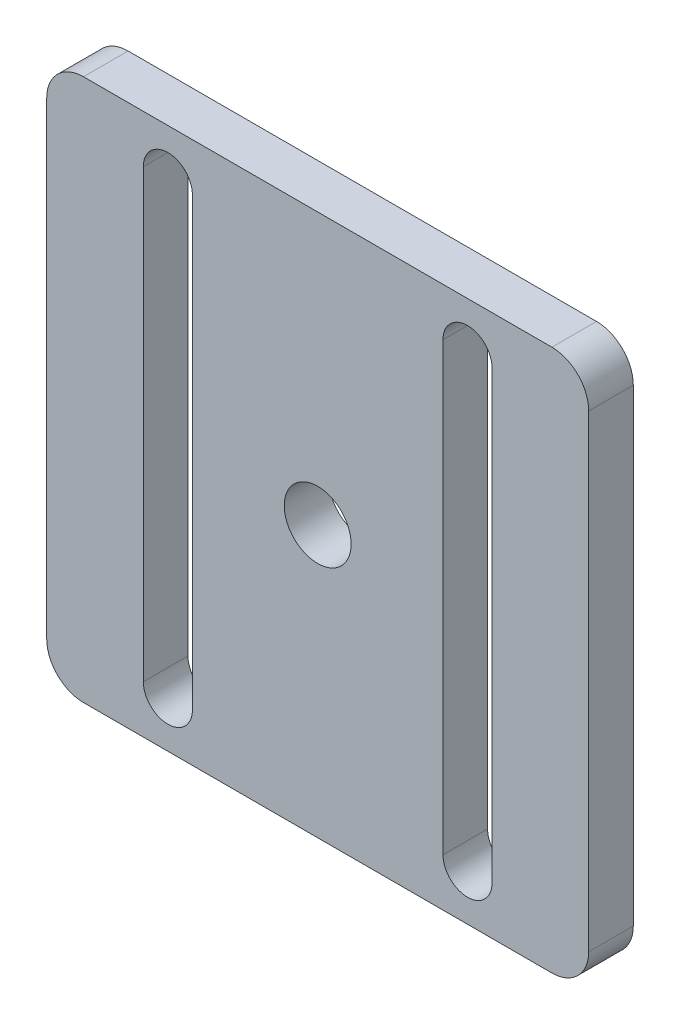
ISO-10303-21;
HEADER;
FILE_DESCRIPTION(('STEP AP214'),'2;1');
FILE_NAME('part.step','',(''),(''),'','','');
FILE_SCHEMA(('AUTOMOTIVE_DESIGN { 1 0 10303 214 1 1 1 1 }'));
ENDSEC;
DATA;
#1=APPLICATION_CONTEXT('core data for automotive mechanical design processes');
#2=APPLICATION_PROTOCOL_DEFINITION('international standard','automotive_design',2000,#1);
#3=PRODUCT_CONTEXT('',#1,'mechanical');
#4=PRODUCT('Part','Part','',(#3));
#5=PRODUCT_RELATED_PRODUCT_CATEGORY('part','',(#4));
#6=PRODUCT_DEFINITION_FORMATION('','',#4);
#7=PRODUCT_DEFINITION_CONTEXT('part definition',#1,'design');
#8=PRODUCT_DEFINITION('design','',#6,#7);
#9=PRODUCT_DEFINITION_SHAPE('','',#8);
#10=(LENGTH_UNIT() NAMED_UNIT(*) SI_UNIT(.MILLI.,.METRE.));
#11=(NAMED_UNIT(*) PLANE_ANGLE_UNIT() SI_UNIT($,.RADIAN.));
#12=(NAMED_UNIT(*) SI_UNIT($,.STERADIAN.) SOLID_ANGLE_UNIT());
#13=UNCERTAINTY_MEASURE_WITH_UNIT(LENGTH_MEASURE(1.E-05),#10,'distance_accuracy_value','');
#14=(GEOMETRIC_REPRESENTATION_CONTEXT(3) GLOBAL_UNCERTAINTY_ASSIGNED_CONTEXT((#13)) GLOBAL_UNIT_ASSIGNED_CONTEXT((#10,
#11,#12)) REPRESENTATION_CONTEXT('',''));
#15=CARTESIAN_POINT('',(0.,0.,0.));
#16=DIRECTION('',(0.,0.,1.));
#17=DIRECTION('',(1.,0.,0.));
#18=AXIS2_PLACEMENT_3D('',#15,#16,#17);
#19=CARTESIAN_POINT('',(-96.327111855095,68.8501976777567,2.));
#20=DIRECTION('',(0.,0.,1.));
#21=DIRECTION('',(1.,0.,0.));
#22=AXIS2_PLACEMENT_3D('',#19,#20,#21);
#23=PLANE('',#22);
#24=CARTESIAN_POINT('',(-106.827111855095,58.3501976777567,2.));
#25=DIRECTION('',(0.,0.,1.));
#26=DIRECTION('',(1.,0.,0.));
#27=AXIS2_PLACEMENT_3D('',#24,#25,#26);
#28=CIRCLE('',#27,1.5);
#29=CARTESIAN_POINT('',(-105.327111855095,58.3501976777567,2.));
#30=VERTEX_POINT('',#29);
#31=EDGE_CURVE('E214',#30,#30,#28,.T.);
#32=ORIENTED_EDGE('',*,*,#31,.F.);
#33=EDGE_LOOP('',(#32));
#34=FACE_BOUND('',#33,.T.);
#35=DIRECTION('',(0.,-1.,0.));
#36=VECTOR('',#35,1.);
#37=CARTESIAN_POINT('',(-114.644626276367,68.3501976777567,2.));
#38=LINE('',#37,#36);
#39=CARTESIAN_POINT('',(-114.644626276367,68.3501976777567,2.));
#40=VERTEX_POINT('',#39);
#41=CARTESIAN_POINT('',(-114.644626276367,48.3501976777567,2.));
#42=VERTEX_POINT('',#41);
#43=EDGE_CURVE('E253',#40,#42,#38,.T.);
#44=ORIENTED_EDGE('',*,*,#43,.F.);
#45=CARTESIAN_POINT('',(-113.544626276367,68.3501976777567,2.));
#46=DIRECTION('',(0.,0.,1.));
#47=DIRECTION('',(1.,0.,0.));
#48=AXIS2_PLACEMENT_3D('',#45,#46,#47);
#49=CIRCLE('',#48,1.1);
#50=CARTESIAN_POINT('',(-112.444626276367,68.3501976777567,2.));
#51=VERTEX_POINT('',#50);
#52=EDGE_CURVE('E251',#51,#40,#49,.T.);
#53=ORIENTED_EDGE('',*,*,#52,.F.);
#54=DIRECTION('',(0.,1.,0.));
#55=VECTOR('',#54,1.);
#56=CARTESIAN_POINT('',(-112.444626276367,48.3501976777567,2.));
#57=LINE('',#56,#55);
#58=CARTESIAN_POINT('',(-112.444626276367,48.3501976777567,2.));
#59=VERTEX_POINT('',#58);
#60=EDGE_CURVE('E259',#59,#51,#57,.T.);
#61=ORIENTED_EDGE('',*,*,#60,.F.);
#62=CARTESIAN_POINT('',(-113.544626276367,48.3501976777567,2.));
#63=DIRECTION('',(0.,0.,1.));
#64=DIRECTION('',(1.,0.,0.));
#65=AXIS2_PLACEMENT_3D('',#62,#63,#64);
#66=CIRCLE('',#65,1.10000000000001);
#67=EDGE_CURVE('E256',#42,#59,#66,.T.);
#68=ORIENTED_EDGE('',*,*,#67,.F.);
#69=EDGE_LOOP('',(#44,#53,#61,#68));
#70=FACE_BOUND('',#69,.T.);
#71=DIRECTION('',(0.,-1.,0.));
#72=VECTOR('',#71,1.);
#73=CARTESIAN_POINT('',(-101.209597433823,68.3501976777567,2.));
#74=LINE('',#73,#72);
#75=CARTESIAN_POINT('',(-101.209597433823,68.3501976777567,2.));
#76=VERTEX_POINT('',#75);
#77=CARTESIAN_POINT('',(-101.209597433823,48.3501976777567,2.));
#78=VERTEX_POINT('',#77);
#79=EDGE_CURVE('E222',#76,#78,#74,.T.);
#80=ORIENTED_EDGE('',*,*,#79,.F.);
#81=CARTESIAN_POINT('',(-100.109597433823,68.3501976777567,2.));
#82=DIRECTION('',(0.,0.,1.));
#83=DIRECTION('',(1.,0.,0.));
#84=AXIS2_PLACEMENT_3D('',#81,#82,#83);
#85=CIRCLE('',#84,1.1);
#86=CARTESIAN_POINT('',(-99.0095974338228,68.3501976777567,2.));
#87=VERTEX_POINT('',#86);
#88=EDGE_CURVE('E220',#87,#76,#85,.T.);
#89=ORIENTED_EDGE('',*,*,#88,.F.);
#90=DIRECTION('',(0.,1.,0.));
#91=VECTOR('',#90,1.);
#92=CARTESIAN_POINT('',(-99.0095974338228,48.3501976777567,2.));
#93=LINE('',#92,#91);
#94=CARTESIAN_POINT('',(-99.0095974338228,48.3501976777567,2.));
#95=VERTEX_POINT('',#94);
#96=EDGE_CURVE('E228',#95,#87,#93,.T.);
#97=ORIENTED_EDGE('',*,*,#96,.F.);
#98=CARTESIAN_POINT('',(-100.109597433823,48.3501976777567,2.));
#99=DIRECTION('',(0.,0.,1.));
#100=DIRECTION('',(1.,0.,0.));
#101=AXIS2_PLACEMENT_3D('',#98,#99,#100);
#102=CIRCLE('',#101,1.1);
#103=EDGE_CURVE('E225',#78,#95,#102,.T.);
#104=ORIENTED_EDGE('',*,*,#103,.F.);
#105=EDGE_LOOP('',(#80,#89,#97,#104));
#106=FACE_BOUND('',#105,.T.);
#107=DIRECTION('',(0.,1.,0.));
#108=VECTOR('',#107,1.);
#109=CARTESIAN_POINT('',(-94.677111855095,47.8501976777567,2.));
#110=LINE('',#109,#108);
#111=CARTESIAN_POINT('',(-94.677111855095,47.8501976777567,2.));
#112=VERTEX_POINT('',#111);
#113=CARTESIAN_POINT('',(-94.677111855095,68.8501976777567,2.));
#114=VERTEX_POINT('',#113);
#115=EDGE_CURVE('E199',#112,#114,#110,.T.);
#116=ORIENTED_EDGE('',*,*,#115,.T.);
#117=CARTESIAN_POINT('',(-96.327111855095,68.8501976777567,2.));
#118=DIRECTION('',(0.,0.,1.));
#119=DIRECTION('',(1.,0.,0.));
#120=AXIS2_PLACEMENT_3D('',#117,#118,#119);
#121=CIRCLE('',#120,1.65);
#122=CARTESIAN_POINT('',(-96.327111855095,70.5001976777567,2.));
#123=VERTEX_POINT('',#122);
#124=EDGE_CURVE('E182',#114,#123,#121,.T.);
#125=ORIENTED_EDGE('',*,*,#124,.T.);
#126=DIRECTION('',(-1.,0.,0.));
#127=VECTOR('',#126,1.);
#128=CARTESIAN_POINT('',(-96.327111855095,70.5001976777567,2.));
#129=LINE('',#128,#127);
#130=CARTESIAN_POINT('',(-117.327111855095,70.5001976777567,2.));
#131=VERTEX_POINT('',#130);
#132=EDGE_CURVE('E185',#123,#131,#129,.T.);
#133=ORIENTED_EDGE('',*,*,#132,.T.);
#134=CARTESIAN_POINT('',(-117.327111855095,68.8501976777567,2.));
#135=DIRECTION('',(0.,0.,1.));
#136=DIRECTION('',(1.,0.,0.));
#137=AXIS2_PLACEMENT_3D('',#134,#135,#136);
#138=CIRCLE('',#137,1.65);
#139=CARTESIAN_POINT('',(-118.977111855095,68.8501976777567,2.));
#140=VERTEX_POINT('',#139);
#141=EDGE_CURVE('E48',#131,#140,#138,.T.);
#142=ORIENTED_EDGE('',*,*,#141,.T.);
#143=DIRECTION('',(0.,-1.,0.));
#144=VECTOR('',#143,1.);
#145=CARTESIAN_POINT('',(-118.977111855095,68.8501976777567,2.));
#146=LINE('',#145,#144);
#147=CARTESIAN_POINT('',(-118.977111855095,47.8501976777567,2.));
#148=VERTEX_POINT('',#147);
#149=EDGE_CURVE('E153',#140,#148,#146,.T.);
#150=ORIENTED_EDGE('',*,*,#149,.T.);
#151=CARTESIAN_POINT('',(-117.327111855095,47.8501976777567,2.));
#152=DIRECTION('',(0.,0.,1.));
#153=DIRECTION('',(1.,0.,0.));
#154=AXIS2_PLACEMENT_3D('',#151,#152,#153);
#155=CIRCLE('',#154,1.65);
#156=CARTESIAN_POINT('',(-117.327111855095,46.2001976777567,2.));
#157=VERTEX_POINT('',#156);
#158=EDGE_CURVE('E190',#148,#157,#155,.T.);
#159=ORIENTED_EDGE('',*,*,#158,.T.);
#160=DIRECTION('',(1.,0.,0.));
#161=VECTOR('',#160,1.);
#162=CARTESIAN_POINT('',(-117.327111855095,46.2001976777567,2.));
#163=LINE('',#162,#161);
#164=CARTESIAN_POINT('',(-96.327111855095,46.2001976777567,2.));
#165=VERTEX_POINT('',#164);
#166=EDGE_CURVE('E193',#157,#165,#163,.T.);
#167=ORIENTED_EDGE('',*,*,#166,.T.);
#168=CARTESIAN_POINT('',(-96.327111855095,47.8501976777567,2.));
#169=DIRECTION('',(0.,0.,1.));
#170=DIRECTION('',(1.,0.,0.));
#171=AXIS2_PLACEMENT_3D('',#168,#169,#170);
#172=CIRCLE('',#171,1.64999999999999);
#173=EDGE_CURVE('E196',#165,#112,#172,.T.);
#174=ORIENTED_EDGE('',*,*,#173,.T.);
#175=EDGE_LOOP('',(#116,#125,#133,#142,#150,#159,#167,#174));
#176=FACE_BOUND('',#175,.T.);
#177=ADVANCED_FACE('F33',(#34,#70,#106,#176),#23,.T.);
#178=CARTESIAN_POINT('',(-96.327111855095,68.8501976777567,0.));
#179=DIRECTION('',(0.,0.,1.));
#180=DIRECTION('',(1.,0.,0.));
#181=AXIS2_PLACEMENT_3D('',#178,#179,#180);
#182=PLANE('',#181);
#183=CARTESIAN_POINT('',(-106.827111855095,58.3501976777567,0.));
#184=DIRECTION('',(0.,0.,1.));
#185=DIRECTION('',(1.,0.,0.));
#186=AXIS2_PLACEMENT_3D('',#183,#184,#185);
#187=CIRCLE('',#186,1.5);
#188=CARTESIAN_POINT('',(-105.327111855095,58.3501976777567,0.));
#189=VERTEX_POINT('',#188);
#190=EDGE_CURVE('E204',#189,#189,#187,.T.);
#191=ORIENTED_EDGE('',*,*,#190,.T.);
#192=EDGE_LOOP('',(#191));
#193=FACE_BOUND('',#192,.T.);
#194=CARTESIAN_POINT('',(-100.109597433823,68.3501976777567,0.));
#195=DIRECTION('',(0.,0.,1.));
#196=DIRECTION('',(1.,0.,0.));
#197=AXIS2_PLACEMENT_3D('',#194,#195,#196);
#198=CIRCLE('',#197,1.1);
#199=CARTESIAN_POINT('',(-99.0095974338228,68.3501976777567,0.));
#200=VERTEX_POINT('',#199);
#201=CARTESIAN_POINT('',(-101.209597433823,68.3501976777567,0.));
#202=VERTEX_POINT('',#201);
#203=EDGE_CURVE('E217',#200,#202,#198,.T.);
#204=ORIENTED_EDGE('',*,*,#203,.T.);
#205=DIRECTION('',(0.,-1.,0.));
#206=VECTOR('',#205,1.);
#207=CARTESIAN_POINT('',(-101.209597433823,68.3501976777567,0.));
#208=LINE('',#207,#206);
#209=CARTESIAN_POINT('',(-101.209597433823,48.3501976777567,0.));
#210=VERTEX_POINT('',#209);
#211=EDGE_CURVE('E233',#202,#210,#208,.T.);
#212=ORIENTED_EDGE('',*,*,#211,.T.);
#213=CARTESIAN_POINT('',(-100.109597433823,48.3501976777567,0.));
#214=DIRECTION('',(0.,0.,1.));
#215=DIRECTION('',(1.,0.,0.));
#216=AXIS2_PLACEMENT_3D('',#213,#214,#215);
#217=CIRCLE('',#216,1.1);
#218=CARTESIAN_POINT('',(-99.0095974338228,48.3501976777567,0.));
#219=VERTEX_POINT('',#218);
#220=EDGE_CURVE('E236',#210,#219,#217,.T.);
#221=ORIENTED_EDGE('',*,*,#220,.T.);
#222=DIRECTION('',(0.,1.,0.));
#223=VECTOR('',#222,1.);
#224=CARTESIAN_POINT('',(-99.0095974338228,48.3501976777567,0.));
#225=LINE('',#224,#223);
#226=EDGE_CURVE('E223',#219,#200,#225,.T.);
#227=ORIENTED_EDGE('',*,*,#226,.T.);
#228=EDGE_LOOP('',(#204,#212,#221,#227));
#229=FACE_BOUND('',#228,.T.);
#230=CARTESIAN_POINT('',(-113.544626276367,68.3501976777567,0.));
#231=DIRECTION('',(0.,0.,1.));
#232=DIRECTION('',(1.,0.,0.));
#233=AXIS2_PLACEMENT_3D('',#230,#231,#232);
#234=CIRCLE('',#233,1.1);
#235=CARTESIAN_POINT('',(-112.444626276367,68.3501976777567,0.));
#236=VERTEX_POINT('',#235);
#237=CARTESIAN_POINT('',(-114.644626276367,68.3501976777567,0.));
#238=VERTEX_POINT('',#237);
#239=EDGE_CURVE('E250',#236,#238,#234,.T.);
#240=ORIENTED_EDGE('',*,*,#239,.T.);
#241=DIRECTION('',(0.,-1.,0.));
#242=VECTOR('',#241,1.);
#243=CARTESIAN_POINT('',(-114.644626276367,68.3501976777567,0.));
#244=LINE('',#243,#242);
#245=CARTESIAN_POINT('',(-114.644626276367,48.3501976777567,0.));
#246=VERTEX_POINT('',#245);
#247=EDGE_CURVE('E264',#238,#246,#244,.T.);
#248=ORIENTED_EDGE('',*,*,#247,.T.);
#249=CARTESIAN_POINT('',(-113.544626276367,48.3501976777567,0.));
#250=DIRECTION('',(0.,0.,1.));
#251=DIRECTION('',(1.,0.,0.));
#252=AXIS2_PLACEMENT_3D('',#249,#250,#251);
#253=CIRCLE('',#252,1.10000000000001);
#254=CARTESIAN_POINT('',(-112.444626276367,48.3501976777567,0.));
#255=VERTEX_POINT('',#254);
#256=EDGE_CURVE('E267',#246,#255,#253,.T.);
#257=ORIENTED_EDGE('',*,*,#256,.T.);
#258=DIRECTION('',(0.,1.,0.));
#259=VECTOR('',#258,1.);
#260=CARTESIAN_POINT('',(-112.444626276367,48.3501976777567,0.));
#261=LINE('',#260,#259);
#262=EDGE_CURVE('E254',#255,#236,#261,.T.);
#263=ORIENTED_EDGE('',*,*,#262,.T.);
#264=EDGE_LOOP('',(#240,#248,#257,#263));
#265=FACE_BOUND('',#264,.T.);
#266=CARTESIAN_POINT('',(-96.327111855095,68.8501976777567,0.));
#267=DIRECTION('',(0.,0.,1.));
#268=DIRECTION('',(1.,0.,0.));
#269=AXIS2_PLACEMENT_3D('',#266,#267,#268);
#270=CIRCLE('',#269,1.65);
#271=CARTESIAN_POINT('',(-94.677111855095,68.8501976777567,0.));
#272=VERTEX_POINT('',#271);
#273=CARTESIAN_POINT('',(-96.327111855095,70.5001976777567,0.));
#274=VERTEX_POINT('',#273);
#275=EDGE_CURVE('E56',#272,#274,#270,.T.);
#276=ORIENTED_EDGE('',*,*,#275,.F.);
#277=DIRECTION('',(0.,1.,0.));
#278=VECTOR('',#277,1.);
#279=CARTESIAN_POINT('',(-94.677111855095,47.8501976777567,0.));
#280=LINE('',#279,#278);
#281=CARTESIAN_POINT('',(-94.677111855095,47.8501976777567,0.));
#282=VERTEX_POINT('',#281);
#283=EDGE_CURVE('E178',#282,#272,#280,.T.);
#284=ORIENTED_EDGE('',*,*,#283,.F.);
#285=CARTESIAN_POINT('',(-96.327111855095,47.8501976777567,0.));
#286=DIRECTION('',(0.,0.,1.));
#287=DIRECTION('',(1.,0.,0.));
#288=AXIS2_PLACEMENT_3D('',#285,#286,#287);
#289=CIRCLE('',#288,1.64999999999999);
#290=CARTESIAN_POINT('',(-96.327111855095,46.2001976777567,0.));
#291=VERTEX_POINT('',#290);
#292=EDGE_CURVE('E175',#291,#282,#289,.T.);
#293=ORIENTED_EDGE('',*,*,#292,.F.);
#294=DIRECTION('',(1.,0.,0.));
#295=VECTOR('',#294,1.);
#296=CARTESIAN_POINT('',(-117.327111855095,46.2001976777567,0.));
#297=LINE('',#296,#295);
#298=CARTESIAN_POINT('',(-117.327111855095,46.2001976777567,0.));
#299=VERTEX_POINT('',#298);
#300=EDGE_CURVE('E169',#299,#291,#297,.T.);
#301=ORIENTED_EDGE('',*,*,#300,.F.);
#302=CARTESIAN_POINT('',(-117.327111855095,47.8501976777567,0.));
#303=DIRECTION('',(0.,0.,1.));
#304=DIRECTION('',(1.,0.,0.));
#305=AXIS2_PLACEMENT_3D('',#302,#303,#304);
#306=CIRCLE('',#305,1.65);
#307=CARTESIAN_POINT('',(-118.977111855095,47.8501976777567,0.));
#308=VERTEX_POINT('',#307);
#309=EDGE_CURVE('E167',#308,#299,#306,.T.);
#310=ORIENTED_EDGE('',*,*,#309,.F.);
#311=DIRECTION('',(0.,-1.,0.));
#312=VECTOR('',#311,1.);
#313=CARTESIAN_POINT('',(-118.977111855095,68.8501976777567,0.));
#314=LINE('',#313,#312);
#315=CARTESIAN_POINT('',(-118.977111855095,68.8501976777567,0.));
#316=VERTEX_POINT('',#315);
#317=EDGE_CURVE('E150',#316,#308,#314,.T.);
#318=ORIENTED_EDGE('',*,*,#317,.F.);
#319=CARTESIAN_POINT('',(-117.327111855095,68.8501976777567,0.));
#320=DIRECTION('',(0.,0.,1.));
#321=DIRECTION('',(1.,0.,0.));
#322=AXIS2_PLACEMENT_3D('',#319,#320,#321);
#323=CIRCLE('',#322,1.65);
#324=CARTESIAN_POINT('',(-117.327111855095,70.5001976777567,0.));
#325=VERTEX_POINT('',#324);
#326=EDGE_CURVE('E158',#325,#316,#323,.T.);
#327=ORIENTED_EDGE('',*,*,#326,.F.);
#328=DIRECTION('',(-1.,0.,0.));
#329=VECTOR('',#328,1.);
#330=CARTESIAN_POINT('',(-96.327111855095,70.5001976777567,0.));
#331=LINE('',#330,#329);
#332=EDGE_CURVE('E163',#274,#325,#331,.T.);
#333=ORIENTED_EDGE('',*,*,#332,.F.);
#334=EDGE_LOOP('',(#276,#284,#293,#301,#310,#318,#327,#333));
#335=FACE_BOUND('',#334,.T.);
#336=ADVANCED_FACE('F35',(#193,#229,#265,#335),#182,.F.);
#337=CARTESIAN_POINT('',(-113.544626276367,68.3501976777567,2.));
#338=DIRECTION('',(0.,0.,-1.));
#339=DIRECTION('',(-1.,0.,0.));
#340=AXIS2_PLACEMENT_3D('',#337,#338,#339);
#341=CYLINDRICAL_SURFACE('',#340,1.1);
#342=ORIENTED_EDGE('',*,*,#239,.F.);
#343=DIRECTION('',(0.,0.,-1.));
#344=VECTOR('',#343,1.);
#345=CARTESIAN_POINT('',(-112.444626276367,68.3501976777567,2.));
#346=LINE('',#345,#344);
#347=EDGE_CURVE('E261',#51,#236,#346,.T.);
#348=ORIENTED_EDGE('',*,*,#347,.F.);
#349=ORIENTED_EDGE('',*,*,#52,.T.);
#350=DIRECTION('',(0.,0.,-1.));
#351=VECTOR('',#350,1.);
#352=CARTESIAN_POINT('',(-114.644626276367,68.3501976777567,2.));
#353=LINE('',#352,#351);
#354=EDGE_CURVE('E11',#40,#238,#353,.T.);
#355=ORIENTED_EDGE('',*,*,#354,.T.);
#356=EDGE_LOOP('',(#342,#348,#349,#355));
#357=FACE_BOUND('',#356,.T.);
#358=ADVANCED_FACE('F288',(#357),#341,.F.);
#359=CARTESIAN_POINT('',(-114.644626276367,68.3501976777567,2.));
#360=DIRECTION('',(1.,0.,0.));
#361=DIRECTION('',(0.,1.,0.));
#362=AXIS2_PLACEMENT_3D('',#359,#360,#361);
#363=PLANE('',#362);
#364=ORIENTED_EDGE('',*,*,#247,.F.);
#365=ORIENTED_EDGE('',*,*,#354,.F.);
#366=ORIENTED_EDGE('',*,*,#43,.T.);
#367=DIRECTION('',(0.,0.,-1.));
#368=VECTOR('',#367,1.);
#369=CARTESIAN_POINT('',(-114.644626276367,48.3501976777567,2.));
#370=LINE('',#369,#368);
#371=EDGE_CURVE('E41',#42,#246,#370,.T.);
#372=ORIENTED_EDGE('',*,*,#371,.T.);
#373=EDGE_LOOP('',(#364,#365,#366,#372));
#374=FACE_BOUND('',#373,.T.);
#375=ADVANCED_FACE('F278',(#374),#363,.T.);
#376=CARTESIAN_POINT('',(-113.544626276367,48.3501976777567,2.));
#377=DIRECTION('',(0.,0.,-1.));
#378=DIRECTION('',(-1.,0.,0.));
#379=AXIS2_PLACEMENT_3D('',#376,#377,#378);
#380=CYLINDRICAL_SURFACE('',#379,1.10000000000001);
#381=ORIENTED_EDGE('',*,*,#256,.F.);
#382=ORIENTED_EDGE('',*,*,#371,.F.);
#383=ORIENTED_EDGE('',*,*,#67,.T.);
#384=DIRECTION('',(0.,0.,-1.));
#385=VECTOR('',#384,1.);
#386=CARTESIAN_POINT('',(-112.444626276367,48.3501976777567,2.));
#387=LINE('',#386,#385);
#388=EDGE_CURVE('E274',#59,#255,#387,.T.);
#389=ORIENTED_EDGE('',*,*,#388,.T.);
#390=EDGE_LOOP('',(#381,#382,#383,#389));
#391=FACE_BOUND('',#390,.T.);
#392=ADVANCED_FACE('F283',(#391),#380,.F.);
#393=CARTESIAN_POINT('',(-112.444626276367,48.3501976777567,2.));
#394=DIRECTION('',(-1.,0.,0.));
#395=DIRECTION('',(0.,0.,1.));
#396=AXIS2_PLACEMENT_3D('',#393,#394,#395);
#397=PLANE('',#396);
#398=ORIENTED_EDGE('',*,*,#262,.F.);
#399=ORIENTED_EDGE('',*,*,#388,.F.);
#400=ORIENTED_EDGE('',*,*,#60,.T.);
#401=ORIENTED_EDGE('',*,*,#347,.T.);
#402=EDGE_LOOP('',(#398,#399,#400,#401));
#403=FACE_BOUND('',#402,.T.);
#404=ADVANCED_FACE('F291',(#403),#397,.T.);
#405=CARTESIAN_POINT('',(-100.109597433823,68.3501976777567,2.));
#406=DIRECTION('',(0.,0.,-1.));
#407=DIRECTION('',(-1.,0.,0.));
#408=AXIS2_PLACEMENT_3D('',#405,#406,#407);
#409=CYLINDRICAL_SURFACE('',#408,1.1);
#410=ORIENTED_EDGE('',*,*,#203,.F.);
#411=DIRECTION('',(0.,0.,-1.));
#412=VECTOR('',#411,1.);
#413=CARTESIAN_POINT('',(-99.0095974338228,68.3501976777567,2.));
#414=LINE('',#413,#412);
#415=EDGE_CURVE('E230',#87,#200,#414,.T.);
#416=ORIENTED_EDGE('',*,*,#415,.F.);
#417=ORIENTED_EDGE('',*,*,#88,.T.);
#418=DIRECTION('',(0.,0.,-1.));
#419=VECTOR('',#418,1.);
#420=CARTESIAN_POINT('',(-101.209597433823,68.3501976777567,2.));
#421=LINE('',#420,#419);
#422=EDGE_CURVE('E247',#76,#202,#421,.T.);
#423=ORIENTED_EDGE('',*,*,#422,.T.);
#424=EDGE_LOOP('',(#410,#416,#417,#423));
#425=FACE_BOUND('',#424,.T.);
#426=ADVANCED_FACE('F355',(#425),#409,.F.);
#427=CARTESIAN_POINT('',(-101.209597433823,68.3501976777567,2.));
#428=DIRECTION('',(1.,0.,0.));
#429=DIRECTION('',(0.,1.,0.));
#430=AXIS2_PLACEMENT_3D('',#427,#428,#429);
#431=PLANE('',#430);
#432=ORIENTED_EDGE('',*,*,#211,.F.);
#433=ORIENTED_EDGE('',*,*,#422,.F.);
#434=ORIENTED_EDGE('',*,*,#79,.T.);
#435=DIRECTION('',(0.,0.,-1.));
#436=VECTOR('',#435,1.);
#437=CARTESIAN_POINT('',(-101.209597433823,48.3501976777567,2.));
#438=LINE('',#437,#436);
#439=EDGE_CURVE('E245',#78,#210,#438,.T.);
#440=ORIENTED_EDGE('',*,*,#439,.T.);
#441=EDGE_LOOP('',(#432,#433,#434,#440));
#442=FACE_BOUND('',#441,.T.);
#443=ADVANCED_FACE('F351',(#442),#431,.T.);
#444=CARTESIAN_POINT('',(-100.109597433823,48.3501976777567,2.));
#445=DIRECTION('',(0.,0.,-1.));
#446=DIRECTION('',(-1.,0.,0.));
#447=AXIS2_PLACEMENT_3D('',#444,#445,#446);
#448=CYLINDRICAL_SURFACE('',#447,1.1);
#449=ORIENTED_EDGE('',*,*,#220,.F.);
#450=ORIENTED_EDGE('',*,*,#439,.F.);
#451=ORIENTED_EDGE('',*,*,#103,.T.);
#452=DIRECTION('',(0.,0.,-1.));
#453=VECTOR('',#452,1.);
#454=CARTESIAN_POINT('',(-99.0095974338228,48.3501976777567,2.));
#455=LINE('',#454,#453);
#456=EDGE_CURVE('E243',#95,#219,#455,.T.);
#457=ORIENTED_EDGE('',*,*,#456,.T.);
#458=EDGE_LOOP('',(#449,#450,#451,#457));
#459=FACE_BOUND('',#458,.T.);
#460=ADVANCED_FACE('F347',(#459),#448,.F.);
#461=CARTESIAN_POINT('',(-99.0095974338228,48.3501976777567,2.));
#462=DIRECTION('',(-1.,0.,0.));
#463=DIRECTION('',(0.,0.,1.));
#464=AXIS2_PLACEMENT_3D('',#461,#462,#463);
#465=PLANE('',#464);
#466=ORIENTED_EDGE('',*,*,#226,.F.);
#467=ORIENTED_EDGE('',*,*,#456,.F.);
#468=ORIENTED_EDGE('',*,*,#96,.T.);
#469=ORIENTED_EDGE('',*,*,#415,.T.);
#470=EDGE_LOOP('',(#466,#467,#468,#469));
#471=FACE_BOUND('',#470,.T.);
#472=ADVANCED_FACE('F343',(#471),#465,.T.);
#473=CARTESIAN_POINT('',(-106.827111855095,58.3501976777567,2.));
#474=DIRECTION('',(0.,0.,-1.));
#475=DIRECTION('',(-1.,0.,0.));
#476=AXIS2_PLACEMENT_3D('',#473,#474,#475);
#477=CYLINDRICAL_SURFACE('',#476,1.5);
#478=ORIENTED_EDGE('',*,*,#31,.T.);
#479=EDGE_LOOP('',(#478));
#480=FACE_BOUND('',#479,.T.);
#481=ORIENTED_EDGE('',*,*,#190,.F.);
#482=EDGE_LOOP('',(#481));
#483=FACE_BOUND('',#482,.T.);
#484=ADVANCED_FACE('F340',(#480,#483),#477,.F.);
#485=CARTESIAN_POINT('',(-96.327111855095,68.8501976777567,0.));
#486=DIRECTION('',(0.,0.,1.));
#487=DIRECTION('',(1.,0.,0.));
#488=AXIS2_PLACEMENT_3D('',#485,#486,#487);
#489=CYLINDRICAL_SURFACE('',#488,1.65);
#490=ORIENTED_EDGE('',*,*,#124,.F.);
#491=DIRECTION('',(0.,0.,1.));
#492=VECTOR('',#491,1.);
#493=CARTESIAN_POINT('',(-94.677111855095,68.8501976777567,0.));
#494=LINE('',#493,#492);
#495=EDGE_CURVE('E202',#272,#114,#494,.T.);
#496=ORIENTED_EDGE('',*,*,#495,.F.);
#497=ORIENTED_EDGE('',*,*,#275,.T.);
#498=DIRECTION('',(0.,0.,1.));
#499=VECTOR('',#498,1.);
#500=CARTESIAN_POINT('',(-96.327111855095,70.5001976777567,0.));
#501=LINE('',#500,#499);
#502=EDGE_CURVE('E181',#274,#123,#501,.T.);
#503=ORIENTED_EDGE('',*,*,#502,.T.);
#504=EDGE_LOOP('',(#490,#496,#497,#503));
#505=FACE_BOUND('',#504,.T.);
#506=ADVANCED_FACE('F307',(#505),#489,.T.);
#507=CARTESIAN_POINT('',(-94.677111855095,47.8501976777567,0.));
#508=DIRECTION('',(1.,0.,0.));
#509=DIRECTION('',(0.,1.,0.));
#510=AXIS2_PLACEMENT_3D('',#507,#508,#509);
#511=PLANE('',#510);
#512=ORIENTED_EDGE('',*,*,#115,.F.);
#513=DIRECTION('',(0.,0.,1.));
#514=VECTOR('',#513,1.);
#515=CARTESIAN_POINT('',(-94.677111855095,47.8501976777567,0.));
#516=LINE('',#515,#514);
#517=EDGE_CURVE('E205',#282,#112,#516,.T.);
#518=ORIENTED_EDGE('',*,*,#517,.F.);
#519=ORIENTED_EDGE('',*,*,#283,.T.);
#520=ORIENTED_EDGE('',*,*,#495,.T.);
#521=EDGE_LOOP('',(#512,#518,#519,#520));
#522=FACE_BOUND('',#521,.T.);
#523=ADVANCED_FACE('F305',(#522),#511,.T.);
#524=CARTESIAN_POINT('',(-96.327111855095,47.8501976777567,0.));
#525=DIRECTION('',(0.,0.,1.));
#526=DIRECTION('',(1.,0.,0.));
#527=AXIS2_PLACEMENT_3D('',#524,#525,#526);
#528=CYLINDRICAL_SURFACE('',#527,1.64999999999999);
#529=ORIENTED_EDGE('',*,*,#173,.F.);
#530=DIRECTION('',(0.,0.,1.));
#531=VECTOR('',#530,1.);
#532=CARTESIAN_POINT('',(-96.327111855095,46.2001976777567,0.));
#533=LINE('',#532,#531);
#534=EDGE_CURVE('E207',#291,#165,#533,.T.);
#535=ORIENTED_EDGE('',*,*,#534,.F.);
#536=ORIENTED_EDGE('',*,*,#292,.T.);
#537=ORIENTED_EDGE('',*,*,#517,.T.);
#538=EDGE_LOOP('',(#529,#535,#536,#537));
#539=FACE_BOUND('',#538,.T.);
#540=ADVANCED_FACE('F319',(#539),#528,.T.);
#541=CARTESIAN_POINT('',(-117.327111855095,46.2001976777567,0.));
#542=DIRECTION('',(0.,-1.,0.));
#543=DIRECTION('',(1.,0.,0.));
#544=AXIS2_PLACEMENT_3D('',#541,#542,#543);
#545=PLANE('',#544);
#546=ORIENTED_EDGE('',*,*,#166,.F.);
#547=DIRECTION('',(0.,0.,1.));
#548=VECTOR('',#547,1.);
#549=CARTESIAN_POINT('',(-117.327111855095,46.2001976777567,0.));
#550=LINE('',#549,#548);
#551=EDGE_CURVE('E209',#299,#157,#550,.T.);
#552=ORIENTED_EDGE('',*,*,#551,.F.);
#553=ORIENTED_EDGE('',*,*,#300,.T.);
#554=ORIENTED_EDGE('',*,*,#534,.T.);
#555=EDGE_LOOP('',(#546,#552,#553,#554));
#556=FACE_BOUND('',#555,.T.);
#557=ADVANCED_FACE('F316',(#556),#545,.T.);
#558=CARTESIAN_POINT('',(-117.327111855095,47.8501976777567,0.));
#559=DIRECTION('',(0.,0.,1.));
#560=DIRECTION('',(1.,0.,0.));
#561=AXIS2_PLACEMENT_3D('',#558,#559,#560);
#562=CYLINDRICAL_SURFACE('',#561,1.65);
#563=ORIENTED_EDGE('',*,*,#158,.F.);
#564=DIRECTION('',(0.,0.,1.));
#565=VECTOR('',#564,1.);
#566=CARTESIAN_POINT('',(-118.977111855095,47.8501976777567,0.));
#567=LINE('',#566,#565);
#568=EDGE_CURVE('E154',#308,#148,#567,.T.);
#569=ORIENTED_EDGE('',*,*,#568,.F.);
#570=ORIENTED_EDGE('',*,*,#309,.T.);
#571=ORIENTED_EDGE('',*,*,#551,.T.);
#572=EDGE_LOOP('',(#563,#569,#570,#571));
#573=FACE_BOUND('',#572,.T.);
#574=ADVANCED_FACE('F314',(#573),#562,.T.);
#575=CARTESIAN_POINT('',(-118.977111855095,68.8501976777567,0.));
#576=DIRECTION('',(-1.,0.,0.));
#577=DIRECTION('',(0.,0.,1.));
#578=AXIS2_PLACEMENT_3D('',#575,#576,#577);
#579=PLANE('',#578);
#580=ORIENTED_EDGE('',*,*,#149,.F.);
#581=DIRECTION('',(0.,0.,1.));
#582=VECTOR('',#581,1.);
#583=CARTESIAN_POINT('',(-118.977111855095,68.8501976777567,0.));
#584=LINE('',#583,#582);
#585=EDGE_CURVE('E146',#316,#140,#584,.T.);
#586=ORIENTED_EDGE('',*,*,#585,.F.);
#587=ORIENTED_EDGE('',*,*,#317,.T.);
#588=ORIENTED_EDGE('',*,*,#568,.T.);
#589=EDGE_LOOP('',(#580,#586,#587,#588));
#590=FACE_BOUND('',#589,.T.);
#591=ADVANCED_FACE('F148',(#590),#579,.T.);
#592=CARTESIAN_POINT('',(-117.327111855095,68.8501976777567,0.));
#593=DIRECTION('',(0.,0.,1.));
#594=DIRECTION('',(1.,0.,0.));
#595=AXIS2_PLACEMENT_3D('',#592,#593,#594);
#596=CYLINDRICAL_SURFACE('',#595,1.65);
#597=ORIENTED_EDGE('',*,*,#141,.F.);
#598=DIRECTION('',(0.,0.,1.));
#599=VECTOR('',#598,1.);
#600=CARTESIAN_POINT('',(-117.327111855095,70.5001976777567,0.));
#601=LINE('',#600,#599);
#602=EDGE_CURVE('E155',#325,#131,#601,.T.);
#603=ORIENTED_EDGE('',*,*,#602,.F.);
#604=ORIENTED_EDGE('',*,*,#326,.T.);
#605=ORIENTED_EDGE('',*,*,#585,.T.);
#606=EDGE_LOOP('',(#597,#603,#604,#605));
#607=FACE_BOUND('',#606,.T.);
#608=ADVANCED_FACE('F159',(#607),#596,.T.);
#609=CARTESIAN_POINT('',(-96.327111855095,70.5001976777567,0.));
#610=DIRECTION('',(0.,1.,0.));
#611=DIRECTION('',(0.,0.,1.));
#612=AXIS2_PLACEMENT_3D('',#609,#610,#611);
#613=PLANE('',#612);
#614=ORIENTED_EDGE('',*,*,#132,.F.);
#615=ORIENTED_EDGE('',*,*,#502,.F.);
#616=ORIENTED_EDGE('',*,*,#332,.T.);
#617=ORIENTED_EDGE('',*,*,#602,.T.);
#618=EDGE_LOOP('',(#614,#615,#616,#617));
#619=FACE_BOUND('',#618,.T.);
#620=ADVANCED_FACE('F310',(#619),#613,.T.);
#621=CLOSED_SHELL('',(#177,#336,#358,#375,#392,#404,#426,#443,#460,#472,#484,#506,#523,#540,
#557,#574,#591,#608,#620));
#622=MANIFOLD_SOLID_BREP('B2',#621);
#623=ADVANCED_BREP_SHAPE_REPRESENTATION('',(#18,#622),#14);
#624=SHAPE_DEFINITION_REPRESENTATION(#9,#623);
ENDSEC;
END-ISO-10303-21;
